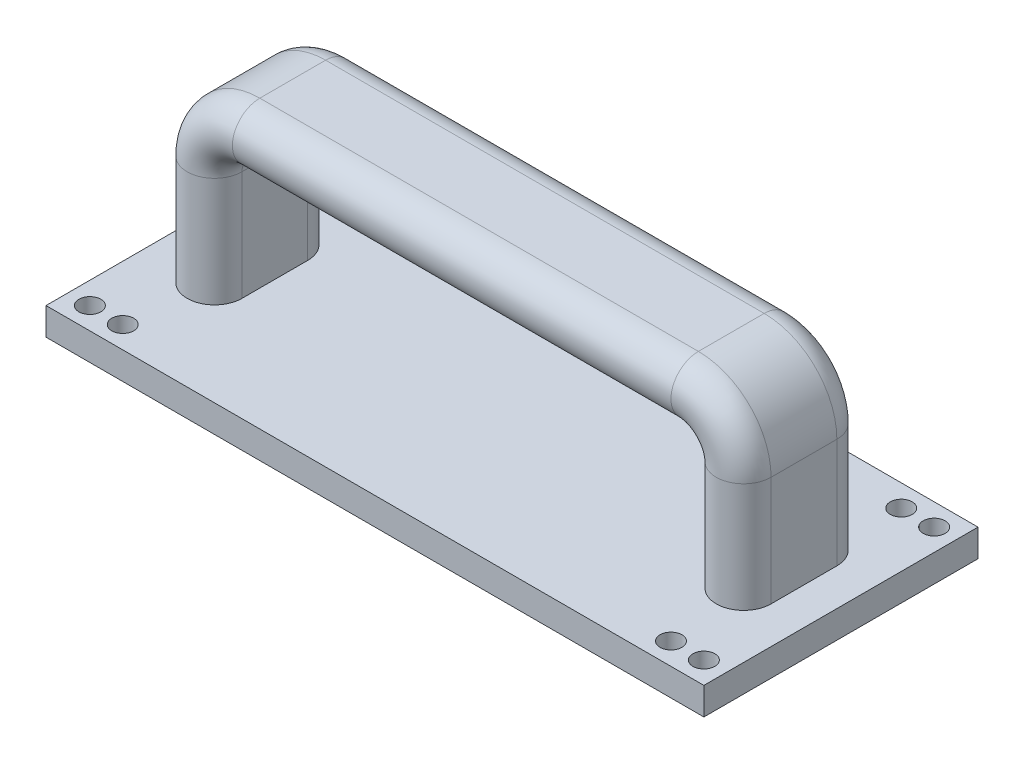
ISO-10303-21;
HEADER;
FILE_DESCRIPTION(('STEP AP214'),'2;1');
FILE_NAME('part.step','',(''),(''),'','','');
FILE_SCHEMA(('AUTOMOTIVE_DESIGN { 1 0 10303 214 1 1 1 1 }'));
ENDSEC;
DATA;
#1=APPLICATION_CONTEXT('core data for automotive mechanical design processes');
#2=APPLICATION_PROTOCOL_DEFINITION('international standard','automotive_design',2000,#1);
#3=PRODUCT_CONTEXT('',#1,'mechanical');
#4=PRODUCT('Part','Part','',(#3));
#5=PRODUCT_RELATED_PRODUCT_CATEGORY('part','',(#4));
#6=PRODUCT_DEFINITION_FORMATION('','',#4);
#7=PRODUCT_DEFINITION_CONTEXT('part definition',#1,'design');
#8=PRODUCT_DEFINITION('design','',#6,#7);
#9=PRODUCT_DEFINITION_SHAPE('','',#8);
#10=(LENGTH_UNIT() NAMED_UNIT(*) SI_UNIT(.MILLI.,.METRE.));
#11=(NAMED_UNIT(*) PLANE_ANGLE_UNIT() SI_UNIT($,.RADIAN.));
#12=(NAMED_UNIT(*) SI_UNIT($,.STERADIAN.) SOLID_ANGLE_UNIT());
#13=UNCERTAINTY_MEASURE_WITH_UNIT(LENGTH_MEASURE(1.E-05),#10,'distance_accuracy_value','');
#14=(GEOMETRIC_REPRESENTATION_CONTEXT(3) GLOBAL_UNCERTAINTY_ASSIGNED_CONTEXT((#13)) GLOBAL_UNIT_ASSIGNED_CONTEXT((#10,
#11,#12)) REPRESENTATION_CONTEXT('',''));
#15=CARTESIAN_POINT('',(0.,0.,0.));
#16=DIRECTION('',(0.,0.,1.));
#17=DIRECTION('',(1.,0.,0.));
#18=AXIS2_PLACEMENT_3D('',#15,#16,#17);
#19=CARTESIAN_POINT('',(0.,5.,0.));
#20=DIRECTION('',(0.,-1.,0.));
#21=DIRECTION('',(0.,0.,-1.));
#22=AXIS2_PLACEMENT_3D('',#19,#20,#21);
#23=PLANE('',#22);
#24=CARTESIAN_POINT('',(56.,5.,21.));
#25=DIRECTION('',(0.,1.,0.));
#26=DIRECTION('',(0.,0.,1.));
#27=AXIS2_PLACEMENT_3D('',#24,#25,#26);
#28=CIRCLE('',#27,2.);
#29=CARTESIAN_POINT('',(56.,5.,23.));
#30=VERTEX_POINT('',#29);
#31=EDGE_CURVE('E497',#30,#30,#28,.T.);
#32=ORIENTED_EDGE('',*,*,#31,.F.);
#33=EDGE_LOOP('',(#32));
#34=FACE_BOUND('',#33,.T.);
#35=CARTESIAN_POINT('',(-56.,5.,21.));
#36=DIRECTION('',(0.,1.,0.));
#37=DIRECTION('',(0.,0.,-1.));
#38=AXIS2_PLACEMENT_3D('',#35,#36,#37);
#39=CIRCLE('',#38,2.);
#40=CARTESIAN_POINT('',(-56.,5.,19.));
#41=VERTEX_POINT('',#40);
#42=EDGE_CURVE('E496',#41,#41,#39,.T.);
#43=ORIENTED_EDGE('',*,*,#42,.F.);
#44=EDGE_LOOP('',(#43));
#45=FACE_BOUND('',#44,.T.);
#46=CARTESIAN_POINT('',(-50.,5.,21.));
#47=DIRECTION('',(0.,1.,0.));
#48=DIRECTION('',(0.,0.,-1.));
#49=AXIS2_PLACEMENT_3D('',#46,#47,#48);
#50=CIRCLE('',#49,2.);
#51=CARTESIAN_POINT('',(-50.,5.,19.));
#52=VERTEX_POINT('',#51);
#53=EDGE_CURVE('E516',#52,#52,#50,.T.);
#54=ORIENTED_EDGE('',*,*,#53,.F.);
#55=EDGE_LOOP('',(#54));
#56=FACE_BOUND('',#55,.T.);
#57=CARTESIAN_POINT('',(-50.,5.,-21.));
#58=DIRECTION('',(0.,1.,0.));
#59=DIRECTION('',(0.,0.,1.));
#60=AXIS2_PLACEMENT_3D('',#57,#58,#59);
#61=CIRCLE('',#60,2.);
#62=CARTESIAN_POINT('',(-50.,5.,-19.));
#63=VERTEX_POINT('',#62);
#64=EDGE_CURVE('E510',#63,#63,#61,.T.);
#65=ORIENTED_EDGE('',*,*,#64,.F.);
#66=EDGE_LOOP('',(#65));
#67=FACE_BOUND('',#66,.T.);
#68=CARTESIAN_POINT('',(50.,5.,21.));
#69=DIRECTION('',(0.,1.,0.));
#70=DIRECTION('',(0.,0.,1.));
#71=AXIS2_PLACEMENT_3D('',#68,#69,#70);
#72=CIRCLE('',#71,2.);
#73=CARTESIAN_POINT('',(50.,5.,23.));
#74=VERTEX_POINT('',#73);
#75=EDGE_CURVE('E502',#74,#74,#72,.T.);
#76=ORIENTED_EDGE('',*,*,#75,.F.);
#77=EDGE_LOOP('',(#76));
#78=FACE_BOUND('',#77,.T.);
#79=CARTESIAN_POINT('',(50.,5.,-21.));
#80=DIRECTION('',(0.,1.,0.));
#81=DIRECTION('',(0.,0.,-1.));
#82=AXIS2_PLACEMENT_3D('',#79,#80,#81);
#83=CIRCLE('',#82,2.);
#84=CARTESIAN_POINT('',(50.,5.,-23.));
#85=VERTEX_POINT('',#84);
#86=EDGE_CURVE('E643',#85,#85,#83,.T.);
#87=ORIENTED_EDGE('',*,*,#86,.F.);
#88=EDGE_LOOP('',(#87));
#89=FACE_BOUND('',#88,.T.);
#90=CARTESIAN_POINT('',(56.,5.,-21.));
#91=DIRECTION('',(0.,1.,0.));
#92=DIRECTION('',(0.,0.,-1.));
#93=AXIS2_PLACEMENT_3D('',#90,#91,#92);
#94=CIRCLE('',#93,2.);
#95=CARTESIAN_POINT('',(56.,5.,-23.));
#96=VERTEX_POINT('',#95);
#97=EDGE_CURVE('E635',#96,#96,#94,.T.);
#98=ORIENTED_EDGE('',*,*,#97,.F.);
#99=EDGE_LOOP('',(#98));
#100=FACE_BOUND('',#99,.T.);
#101=CARTESIAN_POINT('',(-56.,5.,-21.));
#102=DIRECTION('',(0.,1.,0.));
#103=DIRECTION('',(0.,0.,1.));
#104=AXIS2_PLACEMENT_3D('',#101,#102,#103);
#105=CIRCLE('',#104,2.);
#106=CARTESIAN_POINT('',(-56.,5.,-19.));
#107=VERTEX_POINT('',#106);
#108=EDGE_CURVE('E508',#107,#107,#105,.T.);
#109=ORIENTED_EDGE('',*,*,#108,.F.);
#110=EDGE_LOOP('',(#109));
#111=FACE_BOUND('',#110,.T.);
#112=DIRECTION('',(0.,0.,-1.));
#113=VECTOR('',#112,1.);
#114=CARTESIAN_POINT('',(43.2576884315459,5.00000000000001,-6.));
#115=LINE('',#114,#113);
#116=CARTESIAN_POINT('',(43.2576884315459,5.00000000000001,6.));
#117=VERTEX_POINT('',#116);
#118=CARTESIAN_POINT('',(43.2576884315459,5.00000000000001,-6.));
#119=VERTEX_POINT('',#118);
#120=EDGE_CURVE('E155',#117,#119,#115,.T.);
#121=ORIENTED_EDGE('',*,*,#120,.T.);
#122=CARTESIAN_POINT('',(48.2576884315459,5.00000000000001,-6.));
#123=DIRECTION('',(0.,-1.,0.));
#124=DIRECTION('',(0.,0.,1.));
#125=AXIS2_PLACEMENT_3D('',#122,#123,#124);
#126=CIRCLE('',#125,5.);
#127=CARTESIAN_POINT('',(53.2576884315459,5.00000000000001,-6.));
#128=VERTEX_POINT('',#127);
#129=EDGE_CURVE('E157',#119,#128,#126,.T.);
#130=ORIENTED_EDGE('',*,*,#129,.T.);
#131=DIRECTION('',(0.,0.,1.));
#132=VECTOR('',#131,1.);
#133=CARTESIAN_POINT('',(53.2576884315459,5.00000000000001,-6.));
#134=LINE('',#133,#132);
#135=CARTESIAN_POINT('',(53.2576884315459,5.00000000000001,6.));
#136=VERTEX_POINT('',#135);
#137=EDGE_CURVE('E175',#128,#136,#134,.T.);
#138=ORIENTED_EDGE('',*,*,#137,.T.);
#139=CARTESIAN_POINT('',(48.2576884315459,5.00000000000001,6.));
#140=DIRECTION('',(0.,-1.,0.));
#141=DIRECTION('',(0.,0.,1.));
#142=AXIS2_PLACEMENT_3D('',#139,#140,#141);
#143=CIRCLE('',#142,5.);
#144=EDGE_CURVE('E167',#136,#117,#143,.T.);
#145=ORIENTED_EDGE('',*,*,#144,.T.);
#146=EDGE_LOOP('',(#121,#130,#138,#145));
#147=FACE_BOUND('',#146,.T.);
#148=DIRECTION('',(0.,0.,-1.));
#149=VECTOR('',#148,1.);
#150=CARTESIAN_POINT('',(60.,5.,25.));
#151=LINE('',#150,#149);
#152=CARTESIAN_POINT('',(60.,5.,25.));
#153=VERTEX_POINT('',#152);
#154=CARTESIAN_POINT('',(60.,5.,-25.));
#155=VERTEX_POINT('',#154);
#156=EDGE_CURVE('E204',#153,#155,#151,.T.);
#157=ORIENTED_EDGE('',*,*,#156,.T.);
#158=DIRECTION('',(-1.,0.,0.));
#159=VECTOR('',#158,1.);
#160=CARTESIAN_POINT('',(-60.,5.,-25.));
#161=LINE('',#160,#159);
#162=CARTESIAN_POINT('',(-60.,5.,-25.));
#163=VERTEX_POINT('',#162);
#164=EDGE_CURVE('E210',#155,#163,#161,.T.);
#165=ORIENTED_EDGE('',*,*,#164,.T.);
#166=DIRECTION('',(0.,0.,1.));
#167=VECTOR('',#166,1.);
#168=CARTESIAN_POINT('',(-60.,5.,25.));
#169=LINE('',#168,#167);
#170=CARTESIAN_POINT('',(-60.,5.,25.));
#171=VERTEX_POINT('',#170);
#172=EDGE_CURVE('E209',#163,#171,#169,.T.);
#173=ORIENTED_EDGE('',*,*,#172,.T.);
#174=DIRECTION('',(1.,0.,0.));
#175=VECTOR('',#174,1.);
#176=CARTESIAN_POINT('',(-60.,5.,25.));
#177=LINE('',#176,#175);
#178=EDGE_CURVE('E215',#171,#153,#177,.T.);
#179=ORIENTED_EDGE('',*,*,#178,.T.);
#180=EDGE_LOOP('',(#157,#165,#173,#179));
#181=FACE_BOUND('',#180,.T.);
#182=CARTESIAN_POINT('',(-48.2576884315459,5.,-6.));
#183=DIRECTION('',(0.,1.,0.));
#184=DIRECTION('',(0.,0.,1.));
#185=AXIS2_PLACEMENT_3D('',#182,#183,#184);
#186=CIRCLE('',#185,5.);
#187=CARTESIAN_POINT('',(-43.2576884315459,5.,-6.));
#188=VERTEX_POINT('',#187);
#189=CARTESIAN_POINT('',(-53.2576884315459,5.,-6.));
#190=VERTEX_POINT('',#189);
#191=EDGE_CURVE('E62',#188,#190,#186,.T.);
#192=ORIENTED_EDGE('',*,*,#191,.F.);
#193=DIRECTION('',(0.,0.,-1.));
#194=VECTOR('',#193,1.);
#195=CARTESIAN_POINT('',(-43.2576884315459,5.,-6.));
#196=LINE('',#195,#194);
#197=CARTESIAN_POINT('',(-43.2576884315459,5.,6.));
#198=VERTEX_POINT('',#197);
#199=EDGE_CURVE('E551',#198,#188,#196,.T.);
#200=ORIENTED_EDGE('',*,*,#199,.F.);
#201=CARTESIAN_POINT('',(-48.2576884315459,5.,6.));
#202=DIRECTION('',(0.,1.,0.));
#203=DIRECTION('',(0.,0.,1.));
#204=AXIS2_PLACEMENT_3D('',#201,#202,#203);
#205=CIRCLE('',#204,5.);
#206=CARTESIAN_POINT('',(-53.2576884315459,5.,6.));
#207=VERTEX_POINT('',#206);
#208=EDGE_CURVE('E199',#207,#198,#205,.T.);
#209=ORIENTED_EDGE('',*,*,#208,.F.);
#210=DIRECTION('',(0.,0.,1.));
#211=VECTOR('',#210,1.);
#212=CARTESIAN_POINT('',(-53.2576884315459,5.,-6.));
#213=LINE('',#212,#211);
#214=EDGE_CURVE('E589',#190,#207,#213,.T.);
#215=ORIENTED_EDGE('',*,*,#214,.F.);
#216=EDGE_LOOP('',(#192,#200,#209,#215));
#217=FACE_BOUND('',#216,.T.);
#218=ADVANCED_FACE('F39',(#34,#45,#56,#67,#78,#89,#100,#111,#147,#181,#217),#23,.F.);
#219=CARTESIAN_POINT('',(60.,5.,25.));
#220=DIRECTION('',(-1.,0.,0.));
#221=DIRECTION('',(0.,0.,1.));
#222=AXIS2_PLACEMENT_3D('',#219,#220,#221);
#223=PLANE('',#222);
#224=DIRECTION('',(0.,0.,-1.));
#225=VECTOR('',#224,1.);
#226=CARTESIAN_POINT('',(60.,0.,25.));
#227=LINE('',#226,#225);
#228=CARTESIAN_POINT('',(60.,0.,25.));
#229=VERTEX_POINT('',#228);
#230=CARTESIAN_POINT('',(60.,0.,-25.));
#231=VERTEX_POINT('',#230);
#232=EDGE_CURVE('E201',#229,#231,#227,.T.);
#233=ORIENTED_EDGE('',*,*,#232,.T.);
#234=DIRECTION('',(0.,-1.,0.));
#235=VECTOR('',#234,1.);
#236=CARTESIAN_POINT('',(60.,5.,-25.));
#237=LINE('',#236,#235);
#238=EDGE_CURVE('E11',#155,#231,#237,.T.);
#239=ORIENTED_EDGE('',*,*,#238,.F.);
#240=ORIENTED_EDGE('',*,*,#156,.F.);
#241=DIRECTION('',(0.,-1.,0.));
#242=VECTOR('',#241,1.);
#243=CARTESIAN_POINT('',(60.,5.,25.));
#244=LINE('',#243,#242);
#245=EDGE_CURVE('E212',#153,#229,#244,.T.);
#246=ORIENTED_EDGE('',*,*,#245,.T.);
#247=EDGE_LOOP('',(#233,#239,#240,#246));
#248=FACE_BOUND('',#247,.T.);
#249=ADVANCED_FACE('F41',(#248),#223,.F.);
#250=CARTESIAN_POINT('',(-60.,5.,-25.));
#251=DIRECTION('',(0.,0.,1.));
#252=DIRECTION('',(1.,0.,0.));
#253=AXIS2_PLACEMENT_3D('',#250,#251,#252);
#254=PLANE('',#253);
#255=DIRECTION('',(-1.,0.,0.));
#256=VECTOR('',#255,1.);
#257=CARTESIAN_POINT('',(-60.,0.,-25.));
#258=LINE('',#257,#256);
#259=CARTESIAN_POINT('',(-60.,0.,-25.));
#260=VERTEX_POINT('',#259);
#261=EDGE_CURVE('E220',#231,#260,#258,.T.);
#262=ORIENTED_EDGE('',*,*,#261,.T.);
#263=DIRECTION('',(0.,-1.,0.));
#264=VECTOR('',#263,1.);
#265=CARTESIAN_POINT('',(-60.,5.,-25.));
#266=LINE('',#265,#264);
#267=EDGE_CURVE('E50',#163,#260,#266,.T.);
#268=ORIENTED_EDGE('',*,*,#267,.F.);
#269=ORIENTED_EDGE('',*,*,#164,.F.);
#270=ORIENTED_EDGE('',*,*,#238,.T.);
#271=EDGE_LOOP('',(#262,#268,#269,#270));
#272=FACE_BOUND('',#271,.T.);
#273=ADVANCED_FACE('F245',(#272),#254,.F.);
#274=CARTESIAN_POINT('',(-60.,5.,25.));
#275=DIRECTION('',(1.,0.,0.));
#276=DIRECTION('',(0.,0.,-1.));
#277=AXIS2_PLACEMENT_3D('',#274,#275,#276);
#278=PLANE('',#277);
#279=DIRECTION('',(0.,0.,1.));
#280=VECTOR('',#279,1.);
#281=CARTESIAN_POINT('',(-60.,0.,25.));
#282=LINE('',#281,#280);
#283=CARTESIAN_POINT('',(-60.,0.,25.));
#284=VERTEX_POINT('',#283);
#285=EDGE_CURVE('E218',#260,#284,#282,.T.);
#286=ORIENTED_EDGE('',*,*,#285,.T.);
#287=DIRECTION('',(0.,-1.,0.));
#288=VECTOR('',#287,1.);
#289=CARTESIAN_POINT('',(-60.,5.,25.));
#290=LINE('',#289,#288);
#291=EDGE_CURVE('E221',#171,#284,#290,.T.);
#292=ORIENTED_EDGE('',*,*,#291,.F.);
#293=ORIENTED_EDGE('',*,*,#172,.F.);
#294=ORIENTED_EDGE('',*,*,#267,.T.);
#295=EDGE_LOOP('',(#286,#292,#293,#294));
#296=FACE_BOUND('',#295,.T.);
#297=ADVANCED_FACE('F231',(#296),#278,.F.);
#298=CARTESIAN_POINT('',(-60.,5.,25.));
#299=DIRECTION('',(0.,0.,-1.));
#300=DIRECTION('',(-1.,0.,0.));
#301=AXIS2_PLACEMENT_3D('',#298,#299,#300);
#302=PLANE('',#301);
#303=DIRECTION('',(1.,0.,0.));
#304=VECTOR('',#303,1.);
#305=CARTESIAN_POINT('',(-60.,0.,25.));
#306=LINE('',#305,#304);
#307=EDGE_CURVE('E208',#284,#229,#306,.T.);
#308=ORIENTED_EDGE('',*,*,#307,.T.);
#309=ORIENTED_EDGE('',*,*,#245,.F.);
#310=ORIENTED_EDGE('',*,*,#178,.F.);
#311=ORIENTED_EDGE('',*,*,#291,.T.);
#312=EDGE_LOOP('',(#308,#309,#310,#311));
#313=FACE_BOUND('',#312,.T.);
#314=ADVANCED_FACE('F238',(#313),#302,.F.);
#315=CARTESIAN_POINT('',(0.,0.,0.));
#316=DIRECTION('',(0.,-1.,0.));
#317=DIRECTION('',(0.,0.,-1.));
#318=AXIS2_PLACEMENT_3D('',#315,#316,#317);
#319=PLANE('',#318);
#320=CARTESIAN_POINT('',(56.,0.,21.));
#321=DIRECTION('',(0.,1.,0.));
#322=DIRECTION('',(0.,0.,1.));
#323=AXIS2_PLACEMENT_3D('',#320,#321,#322);
#324=CIRCLE('',#323,2.);
#325=CARTESIAN_POINT('',(56.,0.,23.));
#326=VERTEX_POINT('',#325);
#327=EDGE_CURVE('E493',#326,#326,#324,.T.);
#328=ORIENTED_EDGE('',*,*,#327,.T.);
#329=EDGE_LOOP('',(#328));
#330=FACE_BOUND('',#329,.T.);
#331=CARTESIAN_POINT('',(-56.,0.,21.));
#332=DIRECTION('',(0.,1.,0.));
#333=DIRECTION('',(0.,0.,-1.));
#334=AXIS2_PLACEMENT_3D('',#331,#332,#333);
#335=CIRCLE('',#334,2.);
#336=CARTESIAN_POINT('',(-56.,0.,19.));
#337=VERTEX_POINT('',#336);
#338=EDGE_CURVE('E518',#337,#337,#335,.T.);
#339=ORIENTED_EDGE('',*,*,#338,.T.);
#340=EDGE_LOOP('',(#339));
#341=FACE_BOUND('',#340,.T.);
#342=CARTESIAN_POINT('',(-50.,0.,21.));
#343=DIRECTION('',(0.,1.,0.));
#344=DIRECTION('',(0.,0.,-1.));
#345=AXIS2_PLACEMENT_3D('',#342,#343,#344);
#346=CIRCLE('',#345,2.);
#347=CARTESIAN_POINT('',(-50.,0.,19.));
#348=VERTEX_POINT('',#347);
#349=EDGE_CURVE('E511',#348,#348,#346,.T.);
#350=ORIENTED_EDGE('',*,*,#349,.T.);
#351=EDGE_LOOP('',(#350));
#352=FACE_BOUND('',#351,.T.);
#353=CARTESIAN_POINT('',(-50.,0.,-21.));
#354=DIRECTION('',(0.,1.,0.));
#355=DIRECTION('',(0.,0.,1.));
#356=AXIS2_PLACEMENT_3D('',#353,#354,#355);
#357=CIRCLE('',#356,2.);
#358=CARTESIAN_POINT('',(-50.,0.,-19.));
#359=VERTEX_POINT('',#358);
#360=EDGE_CURVE('E506',#359,#359,#357,.T.);
#361=ORIENTED_EDGE('',*,*,#360,.T.);
#362=EDGE_LOOP('',(#361));
#363=FACE_BOUND('',#362,.T.);
#364=CARTESIAN_POINT('',(50.,0.,21.));
#365=DIRECTION('',(0.,1.,0.));
#366=DIRECTION('',(0.,0.,1.));
#367=AXIS2_PLACEMENT_3D('',#364,#365,#366);
#368=CIRCLE('',#367,2.);
#369=CARTESIAN_POINT('',(50.,0.,23.));
#370=VERTEX_POINT('',#369);
#371=EDGE_CURVE('E500',#370,#370,#368,.T.);
#372=ORIENTED_EDGE('',*,*,#371,.T.);
#373=EDGE_LOOP('',(#372));
#374=FACE_BOUND('',#373,.T.);
#375=CARTESIAN_POINT('',(50.,0.,-21.));
#376=DIRECTION('',(0.,1.,0.));
#377=DIRECTION('',(0.,0.,-1.));
#378=AXIS2_PLACEMENT_3D('',#375,#376,#377);
#379=CIRCLE('',#378,2.);
#380=CARTESIAN_POINT('',(50.,0.,-23.));
#381=VERTEX_POINT('',#380);
#382=EDGE_CURVE('E644',#381,#381,#379,.T.);
#383=ORIENTED_EDGE('',*,*,#382,.T.);
#384=EDGE_LOOP('',(#383));
#385=FACE_BOUND('',#384,.T.);
#386=CARTESIAN_POINT('',(56.,0.,-21.));
#387=DIRECTION('',(0.,1.,0.));
#388=DIRECTION('',(0.,0.,-1.));
#389=AXIS2_PLACEMENT_3D('',#386,#387,#388);
#390=CIRCLE('',#389,2.);
#391=CARTESIAN_POINT('',(56.,0.,-23.));
#392=VERTEX_POINT('',#391);
#393=EDGE_CURVE('E636',#392,#392,#390,.T.);
#394=ORIENTED_EDGE('',*,*,#393,.T.);
#395=EDGE_LOOP('',(#394));
#396=FACE_BOUND('',#395,.T.);
#397=CARTESIAN_POINT('',(-56.,0.,-21.));
#398=DIRECTION('',(0.,1.,0.));
#399=DIRECTION('',(0.,0.,1.));
#400=AXIS2_PLACEMENT_3D('',#397,#398,#399);
#401=CIRCLE('',#400,2.);
#402=CARTESIAN_POINT('',(-56.,0.,-19.));
#403=VERTEX_POINT('',#402);
#404=EDGE_CURVE('E159',#403,#403,#401,.T.);
#405=ORIENTED_EDGE('',*,*,#404,.T.);
#406=EDGE_LOOP('',(#405));
#407=FACE_BOUND('',#406,.T.);
#408=ORIENTED_EDGE('',*,*,#232,.F.);
#409=ORIENTED_EDGE('',*,*,#307,.F.);
#410=ORIENTED_EDGE('',*,*,#285,.F.);
#411=ORIENTED_EDGE('',*,*,#261,.F.);
#412=EDGE_LOOP('',(#408,#409,#410,#411));
#413=FACE_BOUND('',#412,.T.);
#414=ADVANCED_FACE('F240',(#330,#341,#352,#363,#374,#385,#396,#407,#413),#319,.T.);
#415=CARTESIAN_POINT('',(43.2576884315459,5.00000000000001,-6.));
#416=DIRECTION('',(1.,0.,0.));
#417=DIRECTION('',(0.,0.,-1.));
#418=AXIS2_PLACEMENT_3D('',#415,#416,#417);
#419=PLANE('',#418);
#420=DIRECTION('',(0.,1.,0.));
#421=VECTOR('',#420,1.);
#422=CARTESIAN_POINT('',(43.2576884315459,5.00000000000001,-6.));
#423=LINE('',#422,#421);
#424=CARTESIAN_POINT('',(43.2576884315459,25.,-6.));
#425=VERTEX_POINT('',#424);
#426=EDGE_CURVE('E53',#119,#425,#423,.T.);
#427=ORIENTED_EDGE('',*,*,#426,.F.);
#428=ORIENTED_EDGE('',*,*,#120,.F.);
#429=DIRECTION('',(0.,1.,0.));
#430=VECTOR('',#429,1.);
#431=CARTESIAN_POINT('',(43.2576884315459,5.00000000000001,6.));
#432=LINE('',#431,#430);
#433=CARTESIAN_POINT('',(43.2576884315459,25.,6.));
#434=VERTEX_POINT('',#433);
#435=EDGE_CURVE('E154',#117,#434,#432,.T.);
#436=ORIENTED_EDGE('',*,*,#435,.T.);
#437=DIRECTION('',(0.,0.,-1.));
#438=VECTOR('',#437,1.);
#439=CARTESIAN_POINT('',(43.2576884315459,25.,-6.));
#440=LINE('',#439,#438);
#441=EDGE_CURVE('E171',#434,#425,#440,.T.);
#442=ORIENTED_EDGE('',*,*,#441,.T.);
#443=EDGE_LOOP('',(#427,#428,#436,#442));
#444=FACE_BOUND('',#443,.T.);
#445=ADVANCED_FACE('F152',(#444),#419,.F.);
#446=CARTESIAN_POINT('',(48.2576884315459,5.00000000000001,-6.));
#447=DIRECTION('',(0.,1.,0.));
#448=DIRECTION('',(0.,0.,1.));
#449=AXIS2_PLACEMENT_3D('',#446,#447,#448);
#450=CYLINDRICAL_SURFACE('',#449,5.);
#451=DIRECTION('',(0.,1.,0.));
#452=VECTOR('',#451,1.);
#453=CARTESIAN_POINT('',(53.2576884315459,5.00000000000001,-6.));
#454=LINE('',#453,#452);
#455=CARTESIAN_POINT('',(53.2576884315459,25.,-6.));
#456=VERTEX_POINT('',#455);
#457=EDGE_CURVE('E563',#128,#456,#454,.T.);
#458=ORIENTED_EDGE('',*,*,#457,.F.);
#459=ORIENTED_EDGE('',*,*,#129,.F.);
#460=ORIENTED_EDGE('',*,*,#426,.T.);
#461=CARTESIAN_POINT('',(48.2576884315459,25.,-6.));
#462=DIRECTION('',(0.,-1.,0.));
#463=DIRECTION('',(0.,0.,1.));
#464=AXIS2_PLACEMENT_3D('',#461,#462,#463);
#465=CIRCLE('',#464,5.);
#466=EDGE_CURVE('E525',#425,#456,#465,.T.);
#467=ORIENTED_EDGE('',*,*,#466,.T.);
#468=EDGE_LOOP('',(#458,#459,#460,#467));
#469=FACE_BOUND('',#468,.T.);
#470=ADVANCED_FACE('F276',(#469),#450,.T.);
#471=CARTESIAN_POINT('',(53.2576884315459,5.00000000000001,-6.));
#472=DIRECTION('',(-1.,0.,0.));
#473=DIRECTION('',(0.,0.,1.));
#474=AXIS2_PLACEMENT_3D('',#471,#472,#473);
#475=PLANE('',#474);
#476=DIRECTION('',(0.,1.,0.));
#477=VECTOR('',#476,1.);
#478=CARTESIAN_POINT('',(53.2576884315459,5.00000000000001,6.));
#479=LINE('',#478,#477);
#480=CARTESIAN_POINT('',(53.2576884315459,25.,6.));
#481=VERTEX_POINT('',#480);
#482=EDGE_CURVE('E184',#136,#481,#479,.T.);
#483=ORIENTED_EDGE('',*,*,#482,.F.);
#484=ORIENTED_EDGE('',*,*,#137,.F.);
#485=ORIENTED_EDGE('',*,*,#457,.T.);
#486=DIRECTION('',(0.,0.,1.));
#487=VECTOR('',#486,1.);
#488=CARTESIAN_POINT('',(53.2576884315459,25.,-6.));
#489=LINE('',#488,#487);
#490=EDGE_CURVE('E570',#456,#481,#489,.T.);
#491=ORIENTED_EDGE('',*,*,#490,.T.);
#492=EDGE_LOOP('',(#483,#484,#485,#491));
#493=FACE_BOUND('',#492,.T.);
#494=ADVANCED_FACE('F287',(#493),#475,.F.);
#495=CARTESIAN_POINT('',(48.2576884315459,5.00000000000001,6.));
#496=DIRECTION('',(0.,1.,0.));
#497=DIRECTION('',(0.,0.,1.));
#498=AXIS2_PLACEMENT_3D('',#495,#496,#497);
#499=CYLINDRICAL_SURFACE('',#498,5.);
#500=CARTESIAN_POINT('',(48.2576884315459,25.,6.));
#501=DIRECTION('',(0.,-1.,0.));
#502=DIRECTION('',(0.,0.,1.));
#503=AXIS2_PLACEMENT_3D('',#500,#501,#502);
#504=CIRCLE('',#503,5.);
#505=EDGE_CURVE('E166',#481,#434,#504,.T.);
#506=ORIENTED_EDGE('',*,*,#505,.T.);
#507=ORIENTED_EDGE('',*,*,#435,.F.);
#508=ORIENTED_EDGE('',*,*,#144,.F.);
#509=ORIENTED_EDGE('',*,*,#482,.T.);
#510=EDGE_LOOP('',(#506,#507,#508,#509));
#511=FACE_BOUND('',#510,.T.);
#512=ADVANCED_FACE('F163',(#511),#499,.T.);
#513=CARTESIAN_POINT('',(40.,25.,0.));
#514=DIRECTION('',(0.,0.,1.));
#515=DIRECTION('',(1.,0.,0.));
#516=AXIS2_PLACEMENT_3D('',#513,#514,#515);
#517=CYLINDRICAL_SURFACE('',#516,3.25768843154593);
#518=CARTESIAN_POINT('',(40.,25.,-6.));
#519=DIRECTION('',(0.,0.,1.));
#520=DIRECTION('',(1.,0.,0.));
#521=AXIS2_PLACEMENT_3D('',#518,#519,#520);
#522=CIRCLE('',#521,3.25768843154593);
#523=CARTESIAN_POINT('',(40.,28.2576884315459,-6.));
#524=VERTEX_POINT('',#523);
#525=EDGE_CURVE('E529',#425,#524,#522,.T.);
#526=ORIENTED_EDGE('',*,*,#525,.F.);
#527=ORIENTED_EDGE('',*,*,#441,.F.);
#528=CARTESIAN_POINT('',(40.,25.,6.));
#529=DIRECTION('',(0.,0.,1.));
#530=DIRECTION('',(1.,0.,0.));
#531=AXIS2_PLACEMENT_3D('',#528,#529,#530);
#532=CIRCLE('',#531,3.25768843154593);
#533=CARTESIAN_POINT('',(40.,28.2576884315459,6.));
#534=VERTEX_POINT('',#533);
#535=EDGE_CURVE('E181',#434,#534,#532,.T.);
#536=ORIENTED_EDGE('',*,*,#535,.T.);
#537=DIRECTION('',(0.,0.,-1.));
#538=VECTOR('',#537,1.);
#539=CARTESIAN_POINT('',(40.,28.2576884315459,-6.));
#540=LINE('',#539,#538);
#541=EDGE_CURVE('E527',#534,#524,#540,.T.);
#542=ORIENTED_EDGE('',*,*,#541,.T.);
#543=EDGE_LOOP('',(#526,#527,#536,#542));
#544=FACE_BOUND('',#543,.T.);
#545=ADVANCED_FACE('F302',(#544),#517,.F.);
#546=CARTESIAN_POINT('',(40.,25.,-6.));
#547=DIRECTION('',(0.,0.,1.));
#548=DIRECTION('',(1.,0.,0.));
#549=AXIS2_PLACEMENT_3D('',#546,#547,#548);
#550=TOROIDAL_SURFACE('',#549,8.25768843154592,5.);
#551=CARTESIAN_POINT('',(40.,25.,-6.));
#552=DIRECTION('',(0.,0.,1.));
#553=DIRECTION('',(1.,0.,0.));
#554=AXIS2_PLACEMENT_3D('',#551,#552,#553);
#555=CIRCLE('',#554,13.2576884315459);
#556=CARTESIAN_POINT('',(40.,38.2576884315459,-6.));
#557=VERTEX_POINT('',#556);
#558=EDGE_CURVE('E568',#456,#557,#555,.T.);
#559=ORIENTED_EDGE('',*,*,#558,.F.);
#560=ORIENTED_EDGE('',*,*,#466,.F.);
#561=ORIENTED_EDGE('',*,*,#525,.T.);
#562=CARTESIAN_POINT('',(40.,33.2576884315459,-6.));
#563=DIRECTION('',(1.,0.,0.));
#564=DIRECTION('',(0.,0.,1.));
#565=AXIS2_PLACEMENT_3D('',#562,#563,#564);
#566=CIRCLE('',#565,5.);
#567=EDGE_CURVE('E531',#524,#557,#566,.T.);
#568=ORIENTED_EDGE('',*,*,#567,.T.);
#569=EDGE_LOOP('',(#559,#560,#561,#568));
#570=FACE_BOUND('',#569,.T.);
#571=ADVANCED_FACE('F310',(#570),#550,.T.);
#572=CARTESIAN_POINT('',(40.,25.,0.));
#573=DIRECTION('',(0.,0.,1.));
#574=DIRECTION('',(1.,0.,0.));
#575=AXIS2_PLACEMENT_3D('',#572,#573,#574);
#576=CYLINDRICAL_SURFACE('',#575,13.2576884315459);
#577=CARTESIAN_POINT('',(40.,25.,6.));
#578=DIRECTION('',(0.,0.,1.));
#579=DIRECTION('',(1.,0.,0.));
#580=AXIS2_PLACEMENT_3D('',#577,#578,#579);
#581=CIRCLE('',#580,13.2576884315459);
#582=CARTESIAN_POINT('',(40.,38.2576884315459,6.));
#583=VERTEX_POINT('',#582);
#584=EDGE_CURVE('E188',#481,#583,#581,.T.);
#585=ORIENTED_EDGE('',*,*,#584,.F.);
#586=ORIENTED_EDGE('',*,*,#490,.F.);
#587=ORIENTED_EDGE('',*,*,#558,.T.);
#588=DIRECTION('',(0.,0.,1.));
#589=VECTOR('',#588,1.);
#590=CARTESIAN_POINT('',(40.,38.2576884315459,-6.));
#591=LINE('',#590,#589);
#592=EDGE_CURVE('E574',#557,#583,#591,.T.);
#593=ORIENTED_EDGE('',*,*,#592,.T.);
#594=EDGE_LOOP('',(#585,#586,#587,#593));
#595=FACE_BOUND('',#594,.T.);
#596=ADVANCED_FACE('F320',(#595),#576,.T.);
#597=CARTESIAN_POINT('',(40.,25.,6.));
#598=DIRECTION('',(0.,0.,1.));
#599=DIRECTION('',(1.,0.,0.));
#600=AXIS2_PLACEMENT_3D('',#597,#598,#599);
#601=TOROIDAL_SURFACE('',#600,8.25768843154592,5.);
#602=CARTESIAN_POINT('',(40.,33.2576884315459,6.));
#603=DIRECTION('',(1.,0.,0.));
#604=DIRECTION('',(0.,0.,1.));
#605=AXIS2_PLACEMENT_3D('',#602,#603,#604);
#606=CIRCLE('',#605,5.);
#607=EDGE_CURVE('E183',#583,#534,#606,.T.);
#608=ORIENTED_EDGE('',*,*,#607,.T.);
#609=ORIENTED_EDGE('',*,*,#535,.F.);
#610=ORIENTED_EDGE('',*,*,#505,.F.);
#611=ORIENTED_EDGE('',*,*,#584,.T.);
#612=EDGE_LOOP('',(#608,#609,#610,#611));
#613=FACE_BOUND('',#612,.T.);
#614=ADVANCED_FACE('F324',(#613),#601,.T.);
#615=CARTESIAN_POINT('',(40.,28.2576884315459,-6.));
#616=DIRECTION('',(0.,1.,0.));
#617=DIRECTION('',(-1.,0.,0.));
#618=AXIS2_PLACEMENT_3D('',#615,#616,#617);
#619=PLANE('',#618);
#620=DIRECTION('',(-1.,0.,0.));
#621=VECTOR('',#620,1.);
#622=CARTESIAN_POINT('',(40.,28.2576884315459,-6.));
#623=LINE('',#622,#621);
#624=CARTESIAN_POINT('',(-40.,28.2576884315459,-6.));
#625=VERTEX_POINT('',#624);
#626=EDGE_CURVE('E537',#524,#625,#623,.T.);
#627=ORIENTED_EDGE('',*,*,#626,.F.);
#628=ORIENTED_EDGE('',*,*,#541,.F.);
#629=DIRECTION('',(-1.,0.,0.));
#630=VECTOR('',#629,1.);
#631=CARTESIAN_POINT('',(40.,28.2576884315459,6.));
#632=LINE('',#631,#630);
#633=CARTESIAN_POINT('',(-40.,28.2576884315459,6.));
#634=VERTEX_POINT('',#633);
#635=EDGE_CURVE('E189',#534,#634,#632,.T.);
#636=ORIENTED_EDGE('',*,*,#635,.T.);
#637=DIRECTION('',(0.,0.,-1.));
#638=VECTOR('',#637,1.);
#639=CARTESIAN_POINT('',(-40.,28.2576884315459,-6.));
#640=LINE('',#639,#638);
#641=EDGE_CURVE('E536',#634,#625,#640,.T.);
#642=ORIENTED_EDGE('',*,*,#641,.T.);
#643=EDGE_LOOP('',(#627,#628,#636,#642));
#644=FACE_BOUND('',#643,.T.);
#645=ADVANCED_FACE('F334',(#644),#619,.F.);
#646=CARTESIAN_POINT('',(40.,33.2576884315459,-6.));
#647=DIRECTION('',(-1.,0.,0.));
#648=DIRECTION('',(0.,-1.,0.));
#649=AXIS2_PLACEMENT_3D('',#646,#647,#648);
#650=CYLINDRICAL_SURFACE('',#649,5.);
#651=DIRECTION('',(-1.,0.,0.));
#652=VECTOR('',#651,1.);
#653=CARTESIAN_POINT('',(40.,38.2576884315459,-6.));
#654=LINE('',#653,#652);
#655=CARTESIAN_POINT('',(-40.,38.2576884315459,-6.));
#656=VERTEX_POINT('',#655);
#657=EDGE_CURVE('E576',#557,#656,#654,.T.);
#658=ORIENTED_EDGE('',*,*,#657,.F.);
#659=ORIENTED_EDGE('',*,*,#567,.F.);
#660=ORIENTED_EDGE('',*,*,#626,.T.);
#661=CARTESIAN_POINT('',(-40.,33.2576884315459,-6.));
#662=DIRECTION('',(1.,0.,0.));
#663=DIRECTION('',(0.,0.,1.));
#664=AXIS2_PLACEMENT_3D('',#661,#662,#663);
#665=CIRCLE('',#664,5.);
#666=EDGE_CURVE('E545',#625,#656,#665,.T.);
#667=ORIENTED_EDGE('',*,*,#666,.T.);
#668=EDGE_LOOP('',(#658,#659,#660,#667));
#669=FACE_BOUND('',#668,.T.);
#670=ADVANCED_FACE('F341',(#669),#650,.T.);
#671=CARTESIAN_POINT('',(40.,38.2576884315459,-6.));
#672=DIRECTION('',(0.,-1.,0.));
#673=DIRECTION('',(1.,0.,0.));
#674=AXIS2_PLACEMENT_3D('',#671,#672,#673);
#675=PLANE('',#674);
#676=DIRECTION('',(-1.,0.,0.));
#677=VECTOR('',#676,1.);
#678=CARTESIAN_POINT('',(40.,38.2576884315459,6.));
#679=LINE('',#678,#677);
#680=CARTESIAN_POINT('',(-40.,38.2576884315459,6.));
#681=VERTEX_POINT('',#680);
#682=EDGE_CURVE('E193',#583,#681,#679,.T.);
#683=ORIENTED_EDGE('',*,*,#682,.F.);
#684=ORIENTED_EDGE('',*,*,#592,.F.);
#685=ORIENTED_EDGE('',*,*,#657,.T.);
#686=DIRECTION('',(0.,0.,1.));
#687=VECTOR('',#686,1.);
#688=CARTESIAN_POINT('',(-40.,38.2576884315459,-6.));
#689=LINE('',#688,#687);
#690=EDGE_CURVE('E578',#656,#681,#689,.T.);
#691=ORIENTED_EDGE('',*,*,#690,.T.);
#692=EDGE_LOOP('',(#683,#684,#685,#691));
#693=FACE_BOUND('',#692,.T.);
#694=ADVANCED_FACE('F349',(#693),#675,.F.);
#695=CARTESIAN_POINT('',(40.,33.2576884315459,6.));
#696=DIRECTION('',(-1.,0.,0.));
#697=DIRECTION('',(0.,-1.,0.));
#698=AXIS2_PLACEMENT_3D('',#695,#696,#697);
#699=CYLINDRICAL_SURFACE('',#698,5.);
#700=CARTESIAN_POINT('',(-40.,33.2576884315459,6.));
#701=DIRECTION('',(1.,0.,0.));
#702=DIRECTION('',(0.,0.,1.));
#703=AXIS2_PLACEMENT_3D('',#700,#701,#702);
#704=CIRCLE('',#703,5.);
#705=EDGE_CURVE('E190',#681,#634,#704,.T.);
#706=ORIENTED_EDGE('',*,*,#705,.T.);
#707=ORIENTED_EDGE('',*,*,#635,.F.);
#708=ORIENTED_EDGE('',*,*,#607,.F.);
#709=ORIENTED_EDGE('',*,*,#682,.T.);
#710=EDGE_LOOP('',(#706,#707,#708,#709));
#711=FACE_BOUND('',#710,.T.);
#712=ADVANCED_FACE('F357',(#711),#699,.T.);
#713=CARTESIAN_POINT('',(-40.,25.,0.));
#714=DIRECTION('',(0.,0.,1.));
#715=DIRECTION('',(1.,0.,0.));
#716=AXIS2_PLACEMENT_3D('',#713,#714,#715);
#717=CYLINDRICAL_SURFACE('',#716,3.25768843154593);
#718=CARTESIAN_POINT('',(-40.,25.,-6.));
#719=DIRECTION('',(0.,0.,1.));
#720=DIRECTION('',(0.,1.,0.));
#721=AXIS2_PLACEMENT_3D('',#718,#719,#720);
#722=CIRCLE('',#721,3.25768843154593);
#723=CARTESIAN_POINT('',(-43.2576884315459,25.,-6.));
#724=VERTEX_POINT('',#723);
#725=EDGE_CURVE('E547',#625,#724,#722,.T.);
#726=ORIENTED_EDGE('',*,*,#725,.F.);
#727=ORIENTED_EDGE('',*,*,#641,.F.);
#728=CARTESIAN_POINT('',(-40.,25.,6.));
#729=DIRECTION('',(0.,0.,1.));
#730=DIRECTION('',(0.,1.,0.));
#731=AXIS2_PLACEMENT_3D('',#728,#729,#730);
#732=CIRCLE('',#731,3.25768843154593);
#733=CARTESIAN_POINT('',(-43.2576884315459,25.,6.));
#734=VERTEX_POINT('',#733);
#735=EDGE_CURVE('E194',#634,#734,#732,.T.);
#736=ORIENTED_EDGE('',*,*,#735,.T.);
#737=DIRECTION('',(0.,0.,-1.));
#738=VECTOR('',#737,1.);
#739=CARTESIAN_POINT('',(-43.2576884315459,25.,-6.));
#740=LINE('',#739,#738);
#741=EDGE_CURVE('E544',#734,#724,#740,.T.);
#742=ORIENTED_EDGE('',*,*,#741,.T.);
#743=EDGE_LOOP('',(#726,#727,#736,#742));
#744=FACE_BOUND('',#743,.T.);
#745=ADVANCED_FACE('F364',(#744),#717,.F.);
#746=CARTESIAN_POINT('',(-40.,25.,-6.));
#747=DIRECTION('',(0.,0.,1.));
#748=DIRECTION('',(1.,0.,0.));
#749=AXIS2_PLACEMENT_3D('',#746,#747,#748);
#750=TOROIDAL_SURFACE('',#749,8.25768843154592,5.);
#751=CARTESIAN_POINT('',(-40.,25.,-6.));
#752=DIRECTION('',(0.,0.,1.));
#753=DIRECTION('',(0.,1.,0.));
#754=AXIS2_PLACEMENT_3D('',#751,#752,#753);
#755=CIRCLE('',#754,13.2576884315459);
#756=CARTESIAN_POINT('',(-53.2576884315459,25.,-6.));
#757=VERTEX_POINT('',#756);
#758=EDGE_CURVE('E582',#656,#757,#755,.T.);
#759=ORIENTED_EDGE('',*,*,#758,.F.);
#760=ORIENTED_EDGE('',*,*,#666,.F.);
#761=ORIENTED_EDGE('',*,*,#725,.T.);
#762=CARTESIAN_POINT('',(-48.2576884315459,25.,-6.));
#763=DIRECTION('',(0.,1.,0.));
#764=DIRECTION('',(0.,0.,1.));
#765=AXIS2_PLACEMENT_3D('',#762,#763,#764);
#766=CIRCLE('',#765,5.);
#767=EDGE_CURVE('E552',#724,#757,#766,.T.);
#768=ORIENTED_EDGE('',*,*,#767,.T.);
#769=EDGE_LOOP('',(#759,#760,#761,#768));
#770=FACE_BOUND('',#769,.T.);
#771=ADVANCED_FACE('F373',(#770),#750,.T.);
#772=CARTESIAN_POINT('',(-40.,25.,0.));
#773=DIRECTION('',(0.,0.,1.));
#774=DIRECTION('',(1.,0.,0.));
#775=AXIS2_PLACEMENT_3D('',#772,#773,#774);
#776=CYLINDRICAL_SURFACE('',#775,13.2576884315459);
#777=CARTESIAN_POINT('',(-40.,25.,6.));
#778=DIRECTION('',(0.,0.,1.));
#779=DIRECTION('',(0.,1.,0.));
#780=AXIS2_PLACEMENT_3D('',#777,#778,#779);
#781=CIRCLE('',#780,13.2576884315459);
#782=CARTESIAN_POINT('',(-53.2576884315459,25.,6.));
#783=VERTEX_POINT('',#782);
#784=EDGE_CURVE('E200',#681,#783,#781,.T.);
#785=ORIENTED_EDGE('',*,*,#784,.F.);
#786=ORIENTED_EDGE('',*,*,#690,.F.);
#787=ORIENTED_EDGE('',*,*,#758,.T.);
#788=DIRECTION('',(0.,0.,1.));
#789=VECTOR('',#788,1.);
#790=CARTESIAN_POINT('',(-53.2576884315459,25.,-6.));
#791=LINE('',#790,#789);
#792=EDGE_CURVE('E584',#757,#783,#791,.T.);
#793=ORIENTED_EDGE('',*,*,#792,.T.);
#794=EDGE_LOOP('',(#785,#786,#787,#793));
#795=FACE_BOUND('',#794,.T.);
#796=ADVANCED_FACE('F381',(#795),#776,.T.);
#797=CARTESIAN_POINT('',(-40.,25.,6.));
#798=DIRECTION('',(0.,0.,1.));
#799=DIRECTION('',(1.,0.,0.));
#800=AXIS2_PLACEMENT_3D('',#797,#798,#799);
#801=TOROIDAL_SURFACE('',#800,8.25768843154592,5.);
#802=CARTESIAN_POINT('',(-48.2576884315459,25.,6.));
#803=DIRECTION('',(0.,1.,0.));
#804=DIRECTION('',(0.,0.,1.));
#805=AXIS2_PLACEMENT_3D('',#802,#803,#804);
#806=CIRCLE('',#805,5.);
#807=EDGE_CURVE('E195',#783,#734,#806,.T.);
#808=ORIENTED_EDGE('',*,*,#807,.T.);
#809=ORIENTED_EDGE('',*,*,#735,.F.);
#810=ORIENTED_EDGE('',*,*,#705,.F.);
#811=ORIENTED_EDGE('',*,*,#784,.T.);
#812=EDGE_LOOP('',(#808,#809,#810,#811));
#813=FACE_BOUND('',#812,.T.);
#814=ADVANCED_FACE('F386',(#813),#801,.T.);
#815=CARTESIAN_POINT('',(-43.2576884315459,25.,-6.));
#816=DIRECTION('',(-1.,0.,0.));
#817=DIRECTION('',(0.,0.,1.));
#818=AXIS2_PLACEMENT_3D('',#815,#816,#817);
#819=PLANE('',#818);
#820=DIRECTION('',(0.,-1.,0.));
#821=VECTOR('',#820,1.);
#822=CARTESIAN_POINT('',(-43.2576884315459,25.,-6.));
#823=LINE('',#822,#821);
#824=EDGE_CURVE('E556',#724,#188,#823,.T.);
#825=ORIENTED_EDGE('',*,*,#824,.F.);
#826=ORIENTED_EDGE('',*,*,#741,.F.);
#827=DIRECTION('',(0.,-1.,0.));
#828=VECTOR('',#827,1.);
#829=CARTESIAN_POINT('',(-43.2576884315459,25.,6.));
#830=LINE('',#829,#828);
#831=EDGE_CURVE('E196',#734,#198,#830,.T.);
#832=ORIENTED_EDGE('',*,*,#831,.T.);
#833=ORIENTED_EDGE('',*,*,#199,.T.);
#834=EDGE_LOOP('',(#825,#826,#832,#833));
#835=FACE_BOUND('',#834,.T.);
#836=ADVANCED_FACE('F397',(#835),#819,.F.);
#837=CARTESIAN_POINT('',(-48.2576884315459,25.,-6.));
#838=DIRECTION('',(0.,-1.,0.));
#839=DIRECTION('',(0.,0.,-1.));
#840=AXIS2_PLACEMENT_3D('',#837,#838,#839);
#841=CYLINDRICAL_SURFACE('',#840,5.);
#842=DIRECTION('',(0.,-1.,0.));
#843=VECTOR('',#842,1.);
#844=CARTESIAN_POINT('',(-53.2576884315459,25.,-6.));
#845=LINE('',#844,#843);
#846=EDGE_CURVE('E590',#757,#190,#845,.T.);
#847=ORIENTED_EDGE('',*,*,#846,.F.);
#848=ORIENTED_EDGE('',*,*,#767,.F.);
#849=ORIENTED_EDGE('',*,*,#824,.T.);
#850=ORIENTED_EDGE('',*,*,#191,.T.);
#851=EDGE_LOOP('',(#847,#848,#849,#850));
#852=FACE_BOUND('',#851,.T.);
#853=ADVANCED_FACE('F404',(#852),#841,.T.);
#854=CARTESIAN_POINT('',(-53.2576884315459,25.,-6.));
#855=DIRECTION('',(1.,0.,0.));
#856=DIRECTION('',(0.,0.,-1.));
#857=AXIS2_PLACEMENT_3D('',#854,#855,#856);
#858=PLANE('',#857);
#859=DIRECTION('',(0.,-1.,0.));
#860=VECTOR('',#859,1.);
#861=CARTESIAN_POINT('',(-53.2576884315459,25.,6.));
#862=LINE('',#861,#860);
#863=EDGE_CURVE('E180',#783,#207,#862,.T.);
#864=ORIENTED_EDGE('',*,*,#863,.F.);
#865=ORIENTED_EDGE('',*,*,#792,.F.);
#866=ORIENTED_EDGE('',*,*,#846,.T.);
#867=ORIENTED_EDGE('',*,*,#214,.T.);
#868=EDGE_LOOP('',(#864,#865,#866,#867));
#869=FACE_BOUND('',#868,.T.);
#870=ADVANCED_FACE('F412',(#869),#858,.F.);
#871=CARTESIAN_POINT('',(-48.2576884315459,25.,6.));
#872=DIRECTION('',(0.,-1.,0.));
#873=DIRECTION('',(0.,0.,-1.));
#874=AXIS2_PLACEMENT_3D('',#871,#872,#873);
#875=CYLINDRICAL_SURFACE('',#874,5.);
#876=ORIENTED_EDGE('',*,*,#208,.T.);
#877=ORIENTED_EDGE('',*,*,#831,.F.);
#878=ORIENTED_EDGE('',*,*,#807,.F.);
#879=ORIENTED_EDGE('',*,*,#863,.T.);
#880=EDGE_LOOP('',(#876,#877,#878,#879));
#881=FACE_BOUND('',#880,.T.);
#882=ADVANCED_FACE('F263',(#881),#875,.T.);
#883=CARTESIAN_POINT('',(-56.,0.,-21.));
#884=DIRECTION('',(0.,1.,0.));
#885=DIRECTION('',(0.,0.,1.));
#886=AXIS2_PLACEMENT_3D('',#883,#884,#885);
#887=CYLINDRICAL_SURFACE('',#886,2.);
#888=ORIENTED_EDGE('',*,*,#404,.F.);
#889=EDGE_LOOP('',(#888));
#890=FACE_BOUND('',#889,.T.);
#891=ORIENTED_EDGE('',*,*,#108,.T.);
#892=EDGE_LOOP('',(#891));
#893=FACE_BOUND('',#892,.T.);
#894=ADVANCED_FACE('F281',(#890,#893),#887,.F.);
#895=CARTESIAN_POINT('',(56.,0.,-21.));
#896=DIRECTION('',(0.,1.,0.));
#897=DIRECTION('',(0.,0.,1.));
#898=AXIS2_PLACEMENT_3D('',#895,#896,#897);
#899=CYLINDRICAL_SURFACE('',#898,2.);
#900=ORIENTED_EDGE('',*,*,#393,.F.);
#901=EDGE_LOOP('',(#900));
#902=FACE_BOUND('',#901,.T.);
#903=ORIENTED_EDGE('',*,*,#97,.T.);
#904=EDGE_LOOP('',(#903));
#905=FACE_BOUND('',#904,.T.);
#906=ADVANCED_FACE('F433',(#902,#905),#899,.F.);
#907=CARTESIAN_POINT('',(50.,0.,-21.));
#908=DIRECTION('',(0.,1.,0.));
#909=DIRECTION('',(0.,0.,1.));
#910=AXIS2_PLACEMENT_3D('',#907,#908,#909);
#911=CYLINDRICAL_SURFACE('',#910,2.);
#912=ORIENTED_EDGE('',*,*,#382,.F.);
#913=EDGE_LOOP('',(#912));
#914=FACE_BOUND('',#913,.T.);
#915=ORIENTED_EDGE('',*,*,#86,.T.);
#916=EDGE_LOOP('',(#915));
#917=FACE_BOUND('',#916,.T.);
#918=ADVANCED_FACE('F442',(#914,#917),#911,.F.);
#919=CARTESIAN_POINT('',(50.,0.,21.));
#920=DIRECTION('',(0.,1.,0.));
#921=DIRECTION('',(0.,0.,1.));
#922=AXIS2_PLACEMENT_3D('',#919,#920,#921);
#923=CYLINDRICAL_SURFACE('',#922,2.);
#924=ORIENTED_EDGE('',*,*,#371,.F.);
#925=EDGE_LOOP('',(#924));
#926=FACE_BOUND('',#925,.T.);
#927=ORIENTED_EDGE('',*,*,#75,.T.);
#928=EDGE_LOOP('',(#927));
#929=FACE_BOUND('',#928,.T.);
#930=ADVANCED_FACE('F448',(#926,#929),#923,.F.);
#931=CARTESIAN_POINT('',(-50.,0.,-21.));
#932=DIRECTION('',(0.,1.,0.));
#933=DIRECTION('',(0.,0.,1.));
#934=AXIS2_PLACEMENT_3D('',#931,#932,#933);
#935=CYLINDRICAL_SURFACE('',#934,2.);
#936=ORIENTED_EDGE('',*,*,#360,.F.);
#937=EDGE_LOOP('',(#936));
#938=FACE_BOUND('',#937,.T.);
#939=ORIENTED_EDGE('',*,*,#64,.T.);
#940=EDGE_LOOP('',(#939));
#941=FACE_BOUND('',#940,.T.);
#942=ADVANCED_FACE('F460',(#938,#941),#935,.F.);
#943=CARTESIAN_POINT('',(-50.,0.,21.));
#944=DIRECTION('',(0.,1.,0.));
#945=DIRECTION('',(0.,0.,1.));
#946=AXIS2_PLACEMENT_3D('',#943,#944,#945);
#947=CYLINDRICAL_SURFACE('',#946,2.);
#948=ORIENTED_EDGE('',*,*,#349,.F.);
#949=EDGE_LOOP('',(#948));
#950=FACE_BOUND('',#949,.T.);
#951=ORIENTED_EDGE('',*,*,#53,.T.);
#952=EDGE_LOOP('',(#951));
#953=FACE_BOUND('',#952,.T.);
#954=ADVANCED_FACE('F465',(#950,#953),#947,.F.);
#955=CARTESIAN_POINT('',(-56.,0.,21.));
#956=DIRECTION('',(0.,1.,0.));
#957=DIRECTION('',(0.,0.,1.));
#958=AXIS2_PLACEMENT_3D('',#955,#956,#957);
#959=CYLINDRICAL_SURFACE('',#958,2.);
#960=ORIENTED_EDGE('',*,*,#338,.F.);
#961=EDGE_LOOP('',(#960));
#962=FACE_BOUND('',#961,.T.);
#963=ORIENTED_EDGE('',*,*,#42,.T.);
#964=EDGE_LOOP('',(#963));
#965=FACE_BOUND('',#964,.T.);
#966=ADVANCED_FACE('F471',(#962,#965),#959,.F.);
#967=CARTESIAN_POINT('',(56.,0.,21.));
#968=DIRECTION('',(0.,1.,0.));
#969=DIRECTION('',(0.,0.,1.));
#970=AXIS2_PLACEMENT_3D('',#967,#968,#969);
#971=CYLINDRICAL_SURFACE('',#970,2.);
#972=ORIENTED_EDGE('',*,*,#327,.F.);
#973=EDGE_LOOP('',(#972));
#974=FACE_BOUND('',#973,.T.);
#975=ORIENTED_EDGE('',*,*,#31,.T.);
#976=EDGE_LOOP('',(#975));
#977=FACE_BOUND('',#976,.T.);
#978=ADVANCED_FACE('F481',(#974,#977),#971,.F.);
#979=CLOSED_SHELL('',(#218,#249,#273,#297,#314,#414,#445,#470,#494,#512,#545,#571,#596,#614,
#645,#670,#694,#712,#745,#771,#796,#814,#836,#853,#870,#882,#894,#906,#918,#930,#942,#954,#966,#978));
#980=MANIFOLD_SOLID_BREP('B2',#979);
#981=ADVANCED_BREP_SHAPE_REPRESENTATION('',(#18,#980),#14);
#982=SHAPE_DEFINITION_REPRESENTATION(#9,#981);
ENDSEC;
END-ISO-10303-21;
